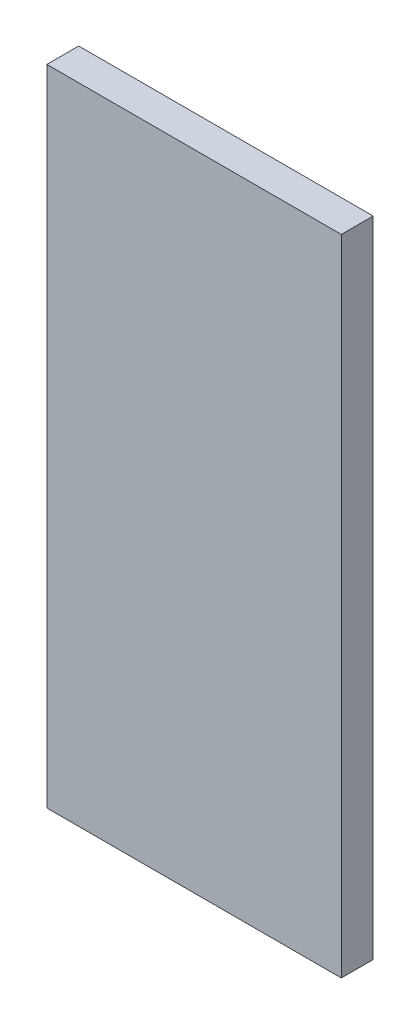
ISO-10303-21;
HEADER;
FILE_DESCRIPTION(('STEP AP214'),'2;1');
FILE_NAME('part.step','',(''),(''),'','','');
FILE_SCHEMA(('AUTOMOTIVE_DESIGN { 1 0 10303 214 1 1 1 1 }'));
ENDSEC;
DATA;
#1=APPLICATION_CONTEXT('core data for automotive mechanical design processes');
#2=APPLICATION_PROTOCOL_DEFINITION('international standard','automotive_design',2000,#1);
#3=PRODUCT_CONTEXT('',#1,'mechanical');
#4=PRODUCT('Part','Part','',(#3));
#5=PRODUCT_RELATED_PRODUCT_CATEGORY('part','',(#4));
#6=PRODUCT_DEFINITION_FORMATION('','',#4);
#7=PRODUCT_DEFINITION_CONTEXT('part definition',#1,'design');
#8=PRODUCT_DEFINITION('design','',#6,#7);
#9=PRODUCT_DEFINITION_SHAPE('','',#8);
#10=(LENGTH_UNIT() NAMED_UNIT(*) SI_UNIT(.MILLI.,.METRE.));
#11=(NAMED_UNIT(*) PLANE_ANGLE_UNIT() SI_UNIT($,.RADIAN.));
#12=(NAMED_UNIT(*) SI_UNIT($,.STERADIAN.) SOLID_ANGLE_UNIT());
#13=UNCERTAINTY_MEASURE_WITH_UNIT(LENGTH_MEASURE(1.E-05),#10,'distance_accuracy_value','');
#14=(GEOMETRIC_REPRESENTATION_CONTEXT(3) GLOBAL_UNCERTAINTY_ASSIGNED_CONTEXT((#13)) GLOBAL_UNIT_ASSIGNED_CONTEXT((#10,
#11,#12)) REPRESENTATION_CONTEXT('',''));
#15=CARTESIAN_POINT('',(0.,0.,0.));
#16=DIRECTION('',(0.,0.,1.));
#17=DIRECTION('',(1.,0.,0.));
#18=AXIS2_PLACEMENT_3D('',#15,#16,#17);
#19=CARTESIAN_POINT('',(-28.26,-8.35,1.1));
#20=DIRECTION('',(0.,1.,0.));
#21=DIRECTION('',(0.,0.,1.));
#22=AXIS2_PLACEMENT_3D('',#19,#20,#21);
#23=PLANE('',#22);
#24=DIRECTION('',(1.,0.,0.));
#25=VECTOR('',#24,1.);
#26=CARTESIAN_POINT('',(-28.26,-8.35,0.));
#27=LINE('',#26,#25);
#28=CARTESIAN_POINT('',(-28.26,-8.35,0.));
#29=VERTEX_POINT('',#28);
#30=CARTESIAN_POINT('',(-18.1,-8.35,0.));
#31=VERTEX_POINT('',#30);
#32=EDGE_CURVE('E102',#29,#31,#27,.T.);
#33=ORIENTED_EDGE('',*,*,#32,.T.);
#34=DIRECTION('',(0.,0.,-1.));
#35=VECTOR('',#34,1.);
#36=CARTESIAN_POINT('',(-18.1,-8.35,1.1));
#37=LINE('',#36,#35);
#38=CARTESIAN_POINT('',(-18.1,-8.35,1.1));
#39=VERTEX_POINT('',#38);
#40=EDGE_CURVE('E11',#39,#31,#37,.T.);
#41=ORIENTED_EDGE('',*,*,#40,.F.);
#42=DIRECTION('',(1.,0.,0.));
#43=VECTOR('',#42,1.);
#44=CARTESIAN_POINT('',(-28.26,-8.35,1.1));
#45=LINE('',#44,#43);
#46=CARTESIAN_POINT('',(-28.26,-8.35,1.1));
#47=VERTEX_POINT('',#46);
#48=EDGE_CURVE('E90',#47,#39,#45,.T.);
#49=ORIENTED_EDGE('',*,*,#48,.F.);
#50=DIRECTION('',(0.,0.,-1.));
#51=VECTOR('',#50,1.);
#52=CARTESIAN_POINT('',(-28.26,-8.35,1.1));
#53=LINE('',#52,#51);
#54=EDGE_CURVE('E98',#47,#29,#53,.T.);
#55=ORIENTED_EDGE('',*,*,#54,.T.);
#56=EDGE_LOOP('',(#33,#41,#49,#55));
#57=FACE_BOUND('',#56,.T.);
#58=ADVANCED_FACE('F39',(#57),#23,.F.);
#59=CARTESIAN_POINT('',(-18.1,-8.35,1.1));
#60=DIRECTION('',(-1.,0.,0.));
#61=DIRECTION('',(0.,0.,1.));
#62=AXIS2_PLACEMENT_3D('',#59,#60,#61);
#63=PLANE('',#62);
#64=DIRECTION('',(0.,1.,0.));
#65=VECTOR('',#64,1.);
#66=CARTESIAN_POINT('',(-18.1,-8.35,0.));
#67=LINE('',#66,#65);
#68=CARTESIAN_POINT('',(-18.1,13.87,0.));
#69=VERTEX_POINT('',#68);
#70=EDGE_CURVE('E94',#31,#69,#67,.T.);
#71=ORIENTED_EDGE('',*,*,#70,.T.);
#72=DIRECTION('',(0.,0.,-1.));
#73=VECTOR('',#72,1.);
#74=CARTESIAN_POINT('',(-18.1,13.87,1.1));
#75=LINE('',#74,#73);
#76=CARTESIAN_POINT('',(-18.1,13.87,1.1));
#77=VERTEX_POINT('',#76);
#78=EDGE_CURVE('E47',#77,#69,#75,.T.);
#79=ORIENTED_EDGE('',*,*,#78,.F.);
#80=DIRECTION('',(0.,1.,0.));
#81=VECTOR('',#80,1.);
#82=CARTESIAN_POINT('',(-18.1,-8.35,1.1));
#83=LINE('',#82,#81);
#84=EDGE_CURVE('E85',#39,#77,#83,.T.);
#85=ORIENTED_EDGE('',*,*,#84,.F.);
#86=ORIENTED_EDGE('',*,*,#40,.T.);
#87=EDGE_LOOP('',(#71,#79,#85,#86));
#88=FACE_BOUND('',#87,.T.);
#89=ADVANCED_FACE('F93',(#88),#63,.F.);
#90=CARTESIAN_POINT('',(-18.1,13.87,1.1));
#91=DIRECTION('',(0.,-1.,0.));
#92=DIRECTION('',(0.,0.,-1.));
#93=AXIS2_PLACEMENT_3D('',#90,#91,#92);
#94=PLANE('',#93);
#95=DIRECTION('',(-1.,0.,0.));
#96=VECTOR('',#95,1.);
#97=CARTESIAN_POINT('',(-18.1,13.87,0.));
#98=LINE('',#97,#96);
#99=CARTESIAN_POINT('',(-28.26,13.87,0.));
#100=VERTEX_POINT('',#99);
#101=EDGE_CURVE('E72',#69,#100,#98,.T.);
#102=ORIENTED_EDGE('',*,*,#101,.T.);
#103=DIRECTION('',(0.,0.,-1.));
#104=VECTOR('',#103,1.);
#105=CARTESIAN_POINT('',(-28.26,13.87,1.1));
#106=LINE('',#105,#104);
#107=CARTESIAN_POINT('',(-28.26,13.87,1.1));
#108=VERTEX_POINT('',#107);
#109=EDGE_CURVE('E95',#108,#100,#106,.T.);
#110=ORIENTED_EDGE('',*,*,#109,.F.);
#111=DIRECTION('',(-1.,0.,0.));
#112=VECTOR('',#111,1.);
#113=CARTESIAN_POINT('',(-18.1,13.87,1.1));
#114=LINE('',#113,#112);
#115=EDGE_CURVE('E88',#77,#108,#114,.T.);
#116=ORIENTED_EDGE('',*,*,#115,.F.);
#117=ORIENTED_EDGE('',*,*,#78,.T.);
#118=EDGE_LOOP('',(#102,#110,#116,#117));
#119=FACE_BOUND('',#118,.T.);
#120=ADVANCED_FACE('F96',(#119),#94,.F.);
#121=CARTESIAN_POINT('',(-28.26,13.87,1.1));
#122=DIRECTION('',(1.,0.,0.));
#123=DIRECTION('',(0.,0.,-1.));
#124=AXIS2_PLACEMENT_3D('',#121,#122,#123);
#125=PLANE('',#124);
#126=DIRECTION('',(0.,-1.,0.));
#127=VECTOR('',#126,1.);
#128=CARTESIAN_POINT('',(-28.26,13.87,0.));
#129=LINE('',#128,#127);
#130=EDGE_CURVE('E78',#100,#29,#129,.T.);
#131=ORIENTED_EDGE('',*,*,#130,.T.);
#132=ORIENTED_EDGE('',*,*,#54,.F.);
#133=DIRECTION('',(0.,-1.,0.));
#134=VECTOR('',#133,1.);
#135=CARTESIAN_POINT('',(-28.26,13.87,1.1));
#136=LINE('',#135,#134);
#137=EDGE_CURVE('E55',#108,#47,#136,.T.);
#138=ORIENTED_EDGE('',*,*,#137,.F.);
#139=ORIENTED_EDGE('',*,*,#109,.T.);
#140=EDGE_LOOP('',(#131,#132,#138,#139));
#141=FACE_BOUND('',#140,.T.);
#142=ADVANCED_FACE('F109',(#141),#125,.F.);
#143=CARTESIAN_POINT('',(-18.1,-8.35,1.1));
#144=DIRECTION('',(0.,0.,1.));
#145=DIRECTION('',(1.,0.,0.));
#146=AXIS2_PLACEMENT_3D('',#143,#144,#145);
#147=PLANE('',#146);
#148=ORIENTED_EDGE('',*,*,#48,.T.);
#149=ORIENTED_EDGE('',*,*,#84,.T.);
#150=ORIENTED_EDGE('',*,*,#115,.T.);
#151=ORIENTED_EDGE('',*,*,#137,.T.);
#152=EDGE_LOOP('',(#148,#149,#150,#151));
#153=FACE_BOUND('',#152,.T.);
#154=ADVANCED_FACE('F86',(#153),#147,.T.);
#155=CARTESIAN_POINT('',(-18.1,-8.35,0.));
#156=DIRECTION('',(0.,0.,1.));
#157=DIRECTION('',(1.,0.,0.));
#158=AXIS2_PLACEMENT_3D('',#155,#156,#157);
#159=PLANE('',#158);
#160=ORIENTED_EDGE('',*,*,#32,.F.);
#161=ORIENTED_EDGE('',*,*,#130,.F.);
#162=ORIENTED_EDGE('',*,*,#101,.F.);
#163=ORIENTED_EDGE('',*,*,#70,.F.);
#164=EDGE_LOOP('',(#160,#161,#162,#163));
#165=FACE_BOUND('',#164,.T.);
#166=ADVANCED_FACE('F112',(#165),#159,.F.);
#167=CLOSED_SHELL('',(#58,#89,#120,#142,#154,#166));
#168=MANIFOLD_SOLID_BREP('B2',#167);
#169=ADVANCED_BREP_SHAPE_REPRESENTATION('',(#18,#168),#14);
#170=SHAPE_DEFINITION_REPRESENTATION(#9,#169);
ENDSEC;
END-ISO-10303-21;
